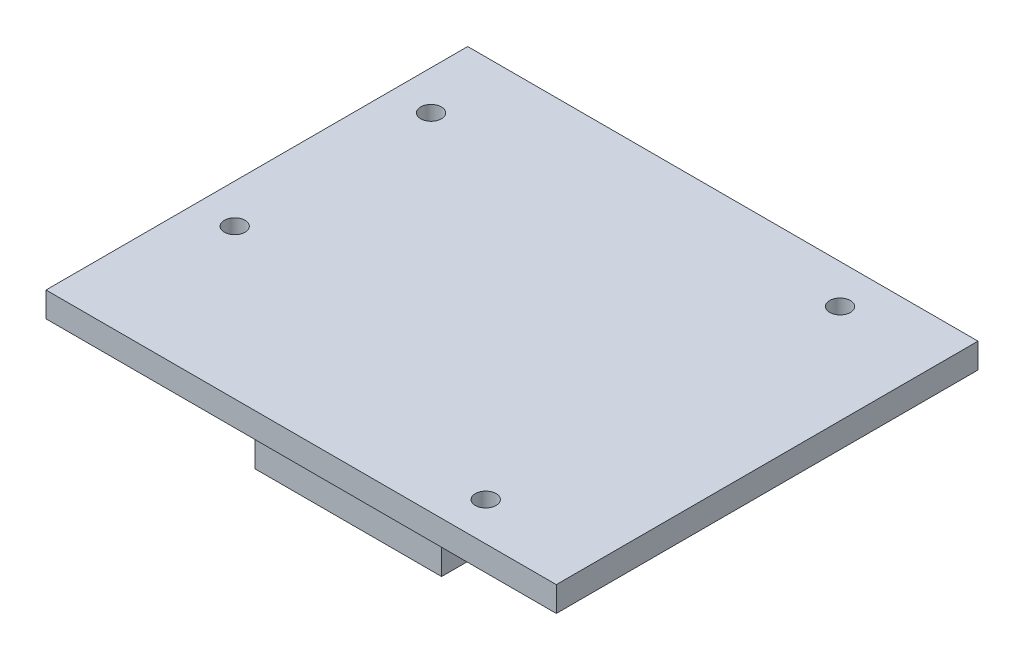
ISO-10303-21;
HEADER;
FILE_DESCRIPTION(('STEP AP214'),'2;1');
FILE_NAME('part.step','',(''),(''),'','','');
FILE_SCHEMA(('AUTOMOTIVE_DESIGN { 1 0 10303 214 1 1 1 1 }'));
ENDSEC;
DATA;
#1=APPLICATION_CONTEXT('core data for automotive mechanical design processes');
#2=APPLICATION_PROTOCOL_DEFINITION('international standard','automotive_design',2000,#1);
#3=PRODUCT_CONTEXT('',#1,'mechanical');
#4=PRODUCT('Part','Part','',(#3));
#5=PRODUCT_RELATED_PRODUCT_CATEGORY('part','',(#4));
#6=PRODUCT_DEFINITION_FORMATION('','',#4);
#7=PRODUCT_DEFINITION_CONTEXT('part definition',#1,'design');
#8=PRODUCT_DEFINITION('design','',#6,#7);
#9=PRODUCT_DEFINITION_SHAPE('','',#8);
#10=(LENGTH_UNIT() NAMED_UNIT(*) SI_UNIT(.MILLI.,.METRE.));
#11=(NAMED_UNIT(*) PLANE_ANGLE_UNIT() SI_UNIT($,.RADIAN.));
#12=(NAMED_UNIT(*) SI_UNIT($,.STERADIAN.) SOLID_ANGLE_UNIT());
#13=UNCERTAINTY_MEASURE_WITH_UNIT(LENGTH_MEASURE(1.E-05),#10,'distance_accuracy_value','');
#14=(GEOMETRIC_REPRESENTATION_CONTEXT(3) GLOBAL_UNCERTAINTY_ASSIGNED_CONTEXT((#13)) GLOBAL_UNIT_ASSIGNED_CONTEXT((#10,
#11,#12)) REPRESENTATION_CONTEXT('',''));
#15=CARTESIAN_POINT('',(0.,0.,0.));
#16=DIRECTION('',(0.,0.,1.));
#17=DIRECTION('',(1.,0.,0.));
#18=AXIS2_PLACEMENT_3D('',#15,#16,#17);
#19=CARTESIAN_POINT('',(0.,-3.5,0.));
#20=DIRECTION('',(0.,1.,0.));
#21=DIRECTION('',(0.,0.,1.));
#22=AXIS2_PLACEMENT_3D('',#19,#20,#21);
#23=PLANE('',#22);
#24=DIRECTION('',(0.,0.,1.));
#25=VECTOR('',#24,1.);
#26=CARTESIAN_POINT('',(-35.7,-3.5,29.5));
#27=LINE('',#26,#25);
#28=CARTESIAN_POINT('',(-35.7,-3.5,-29.5));
#29=VERTEX_POINT('',#28);
#30=CARTESIAN_POINT('',(-35.7,-3.5,29.5));
#31=VERTEX_POINT('',#30);
#32=EDGE_CURVE('E207',#29,#31,#27,.T.);
#33=ORIENTED_EDGE('',*,*,#32,.F.);
#34=DIRECTION('',(-1.,0.,0.));
#35=VECTOR('',#34,1.);
#36=CARTESIAN_POINT('',(35.7,-3.5,-29.5));
#37=LINE('',#36,#35);
#38=CARTESIAN_POINT('',(35.7,-3.5,-29.5));
#39=VERTEX_POINT('',#38);
#40=EDGE_CURVE('E217',#39,#29,#37,.T.);
#41=ORIENTED_EDGE('',*,*,#40,.F.);
#42=DIRECTION('',(0.,0.,-1.));
#43=VECTOR('',#42,1.);
#44=CARTESIAN_POINT('',(35.7,-3.5,29.5));
#45=LINE('',#44,#43);
#46=CARTESIAN_POINT('',(35.7,-3.5,29.5));
#47=VERTEX_POINT('',#46);
#48=EDGE_CURVE('E214',#47,#39,#45,.T.);
#49=ORIENTED_EDGE('',*,*,#48,.F.);
#50=DIRECTION('',(1.,0.,0.));
#51=VECTOR('',#50,1.);
#52=CARTESIAN_POINT('',(35.7,-3.5,29.5));
#53=LINE('',#52,#51);
#54=EDGE_CURVE('E210',#31,#47,#53,.T.);
#55=ORIENTED_EDGE('',*,*,#54,.F.);
#56=EDGE_LOOP('',(#33,#41,#49,#55));
#57=FACE_BOUND('',#56,.T.);
#58=CARTESIAN_POINT('',(20.453418066521,-3.5,24.1305439149757));
#59=DIRECTION('',(0.,1.,0.));
#60=DIRECTION('',(0.,0.,1.));
#61=AXIS2_PLACEMENT_3D('',#58,#59,#60);
#62=CIRCLE('',#61,1.45);
#63=CARTESIAN_POINT('',(20.453418066521,-3.5,25.5805439149757));
#64=VERTEX_POINT('',#63);
#65=EDGE_CURVE('E203',#64,#64,#62,.T.);
#66=ORIENTED_EDGE('',*,*,#65,.T.);
#67=EDGE_LOOP('',(#66));
#68=FACE_BOUND('',#67,.T.);
#69=CARTESIAN_POINT('',(-30.2235775893681,-3.5,-18.9));
#70=DIRECTION('',(0.,1.,0.));
#71=DIRECTION('',(0.,0.,1.));
#72=AXIS2_PLACEMENT_3D('',#69,#70,#71);
#73=CIRCLE('',#72,1.45);
#74=CARTESIAN_POINT('',(-30.2235775893681,-3.5,-17.45));
#75=VERTEX_POINT('',#74);
#76=EDGE_CURVE('E192',#75,#75,#73,.T.);
#77=ORIENTED_EDGE('',*,*,#76,.T.);
#78=EDGE_LOOP('',(#77));
#79=FACE_BOUND('',#78,.T.);
#80=CARTESIAN_POINT('',(-30.2235775893681,-3.5,8.57796743821394));
#81=DIRECTION('',(0.,1.,0.));
#82=DIRECTION('',(0.,0.,1.));
#83=AXIS2_PLACEMENT_3D('',#80,#81,#82);
#84=CIRCLE('',#83,1.45);
#85=CARTESIAN_POINT('',(-30.2235775893681,-3.5,10.0279674382139));
#86=VERTEX_POINT('',#85);
#87=EDGE_CURVE('E196',#86,#86,#84,.T.);
#88=ORIENTED_EDGE('',*,*,#87,.T.);
#89=EDGE_LOOP('',(#88));
#90=FACE_BOUND('',#89,.T.);
#91=CARTESIAN_POINT('',(21.85,-3.5,-24.05));
#92=DIRECTION('',(0.,1.,0.));
#93=DIRECTION('',(0.,0.,1.));
#94=AXIS2_PLACEMENT_3D('',#91,#92,#93);
#95=CIRCLE('',#94,1.45);
#96=CARTESIAN_POINT('',(21.85,-3.5,-22.6));
#97=VERTEX_POINT('',#96);
#98=EDGE_CURVE('E199',#97,#97,#95,.T.);
#99=ORIENTED_EDGE('',*,*,#98,.T.);
#100=EDGE_LOOP('',(#99));
#101=FACE_BOUND('',#100,.T.);
#102=DIRECTION('',(0.,0.,-1.));
#103=VECTOR('',#102,1.);
#104=CARTESIAN_POINT('',(-13.055,-3.5,-22.9));
#105=LINE('',#104,#103);
#106=CARTESIAN_POINT('',(-13.055,-3.5,22.9));
#107=VERTEX_POINT('',#106);
#108=CARTESIAN_POINT('',(-13.055,-3.5,-22.9));
#109=VERTEX_POINT('',#108);
#110=EDGE_CURVE('E158',#107,#109,#105,.T.);
#111=ORIENTED_EDGE('',*,*,#110,.F.);
#112=DIRECTION('',(-1.,0.,0.));
#113=VECTOR('',#112,1.);
#114=CARTESIAN_POINT('',(13.055,-3.5,22.9));
#115=LINE('',#114,#113);
#116=CARTESIAN_POINT('',(13.055,-3.5,22.9));
#117=VERTEX_POINT('',#116);
#118=EDGE_CURVE('E166',#117,#107,#115,.T.);
#119=ORIENTED_EDGE('',*,*,#118,.F.);
#120=DIRECTION('',(0.,0.,1.));
#121=VECTOR('',#120,1.);
#122=CARTESIAN_POINT('',(13.055,-3.5,-22.9));
#123=LINE('',#122,#121);
#124=CARTESIAN_POINT('',(13.055,-3.5,-22.9));
#125=VERTEX_POINT('',#124);
#126=EDGE_CURVE('E176',#125,#117,#123,.T.);
#127=ORIENTED_EDGE('',*,*,#126,.F.);
#128=DIRECTION('',(1.,0.,0.));
#129=VECTOR('',#128,1.);
#130=CARTESIAN_POINT('',(13.055,-3.5,-22.9));
#131=LINE('',#130,#129);
#132=EDGE_CURVE('E58',#109,#125,#131,.T.);
#133=ORIENTED_EDGE('',*,*,#132,.F.);
#134=EDGE_LOOP('',(#111,#119,#127,#133));
#135=FACE_BOUND('',#134,.T.);
#136=ADVANCED_FACE('F33',(#57,#68,#79,#90,#101,#135),#23,.F.);
#137=CARTESIAN_POINT('',(-35.7,-3.5,29.5));
#138=DIRECTION('',(-1.,0.,0.));
#139=DIRECTION('',(0.,0.,1.));
#140=AXIS2_PLACEMENT_3D('',#137,#138,#139);
#141=PLANE('',#140);
#142=DIRECTION('',(0.,0.,1.));
#143=VECTOR('',#142,1.);
#144=CARTESIAN_POINT('',(-35.7,0.,29.5));
#145=LINE('',#144,#143);
#146=CARTESIAN_POINT('',(-35.7,0.,-29.5));
#147=VERTEX_POINT('',#146);
#148=CARTESIAN_POINT('',(-35.7,0.,29.5));
#149=VERTEX_POINT('',#148);
#150=EDGE_CURVE('E206',#147,#149,#145,.T.);
#151=ORIENTED_EDGE('',*,*,#150,.F.);
#152=DIRECTION('',(0.,1.,0.));
#153=VECTOR('',#152,1.);
#154=CARTESIAN_POINT('',(-35.7,-3.5,-29.5));
#155=LINE('',#154,#153);
#156=EDGE_CURVE('E11',#29,#147,#155,.T.);
#157=ORIENTED_EDGE('',*,*,#156,.F.);
#158=ORIENTED_EDGE('',*,*,#32,.T.);
#159=DIRECTION('',(0.,1.,0.));
#160=VECTOR('',#159,1.);
#161=CARTESIAN_POINT('',(-35.7,-3.5,29.5));
#162=LINE('',#161,#160);
#163=EDGE_CURVE('E220',#31,#149,#162,.T.);
#164=ORIENTED_EDGE('',*,*,#163,.T.);
#165=EDGE_LOOP('',(#151,#157,#158,#164));
#166=FACE_BOUND('',#165,.T.);
#167=ADVANCED_FACE('F35',(#166),#141,.T.);
#168=CARTESIAN_POINT('',(35.7,-3.5,-29.5));
#169=DIRECTION('',(0.,0.,-1.));
#170=DIRECTION('',(-1.,0.,0.));
#171=AXIS2_PLACEMENT_3D('',#168,#169,#170);
#172=PLANE('',#171);
#173=DIRECTION('',(-1.,0.,0.));
#174=VECTOR('',#173,1.);
#175=CARTESIAN_POINT('',(35.7,0.,-29.5));
#176=LINE('',#175,#174);
#177=CARTESIAN_POINT('',(35.7,0.,-29.5));
#178=VERTEX_POINT('',#177);
#179=EDGE_CURVE('E211',#178,#147,#176,.T.);
#180=ORIENTED_EDGE('',*,*,#179,.F.);
#181=DIRECTION('',(0.,1.,0.));
#182=VECTOR('',#181,1.);
#183=CARTESIAN_POINT('',(35.7,-3.5,-29.5));
#184=LINE('',#183,#182);
#185=EDGE_CURVE('E42',#39,#178,#184,.T.);
#186=ORIENTED_EDGE('',*,*,#185,.F.);
#187=ORIENTED_EDGE('',*,*,#40,.T.);
#188=ORIENTED_EDGE('',*,*,#156,.T.);
#189=EDGE_LOOP('',(#180,#186,#187,#188));
#190=FACE_BOUND('',#189,.T.);
#191=ADVANCED_FACE('F267',(#190),#172,.T.);
#192=CARTESIAN_POINT('',(35.7,-3.5,29.5));
#193=DIRECTION('',(1.,0.,0.));
#194=DIRECTION('',(0.,0.,-1.));
#195=AXIS2_PLACEMENT_3D('',#192,#193,#194);
#196=PLANE('',#195);
#197=DIRECTION('',(0.,0.,-1.));
#198=VECTOR('',#197,1.);
#199=CARTESIAN_POINT('',(35.7,0.,29.5));
#200=LINE('',#199,#198);
#201=CARTESIAN_POINT('',(35.7,0.,29.5));
#202=VERTEX_POINT('',#201);
#203=EDGE_CURVE('E226',#202,#178,#200,.T.);
#204=ORIENTED_EDGE('',*,*,#203,.F.);
#205=DIRECTION('',(0.,1.,0.));
#206=VECTOR('',#205,1.);
#207=CARTESIAN_POINT('',(35.7,-3.5,29.5));
#208=LINE('',#207,#206);
#209=EDGE_CURVE('E232',#47,#202,#208,.T.);
#210=ORIENTED_EDGE('',*,*,#209,.F.);
#211=ORIENTED_EDGE('',*,*,#48,.T.);
#212=ORIENTED_EDGE('',*,*,#185,.T.);
#213=EDGE_LOOP('',(#204,#210,#211,#212));
#214=FACE_BOUND('',#213,.T.);
#215=ADVANCED_FACE('F265',(#214),#196,.T.);
#216=CARTESIAN_POINT('',(35.7,-3.5,29.5));
#217=DIRECTION('',(0.,0.,1.));
#218=DIRECTION('',(1.,0.,0.));
#219=AXIS2_PLACEMENT_3D('',#216,#217,#218);
#220=PLANE('',#219);
#221=DIRECTION('',(1.,0.,0.));
#222=VECTOR('',#221,1.);
#223=CARTESIAN_POINT('',(35.7,0.,29.5));
#224=LINE('',#223,#222);
#225=EDGE_CURVE('E223',#149,#202,#224,.T.);
#226=ORIENTED_EDGE('',*,*,#225,.F.);
#227=ORIENTED_EDGE('',*,*,#163,.F.);
#228=ORIENTED_EDGE('',*,*,#54,.T.);
#229=ORIENTED_EDGE('',*,*,#209,.T.);
#230=EDGE_LOOP('',(#226,#227,#228,#229));
#231=FACE_BOUND('',#230,.T.);
#232=ADVANCED_FACE('F248',(#231),#220,.T.);
#233=CARTESIAN_POINT('',(0.,0.,0.));
#234=DIRECTION('',(0.,1.,0.));
#235=DIRECTION('',(0.,0.,1.));
#236=AXIS2_PLACEMENT_3D('',#233,#234,#235);
#237=PLANE('',#236);
#238=CARTESIAN_POINT('',(21.85,0.,-24.05));
#239=DIRECTION('',(0.,1.,0.));
#240=DIRECTION('',(0.,0.,1.));
#241=AXIS2_PLACEMENT_3D('',#238,#239,#240);
#242=CIRCLE('',#241,1.45);
#243=CARTESIAN_POINT('',(21.85,0.,-22.6));
#244=VERTEX_POINT('',#243);
#245=EDGE_CURVE('E37',#244,#244,#242,.T.);
#246=ORIENTED_EDGE('',*,*,#245,.F.);
#247=EDGE_LOOP('',(#246));
#248=FACE_BOUND('',#247,.T.);
#249=CARTESIAN_POINT('',(-30.2235775893681,0.,8.57796743821394));
#250=DIRECTION('',(0.,1.,0.));
#251=DIRECTION('',(0.,0.,1.));
#252=AXIS2_PLACEMENT_3D('',#249,#250,#251);
#253=CIRCLE('',#252,1.45);
#254=CARTESIAN_POINT('',(-30.2235775893681,0.,10.0279674382139));
#255=VERTEX_POINT('',#254);
#256=EDGE_CURVE('E195',#255,#255,#253,.T.);
#257=ORIENTED_EDGE('',*,*,#256,.F.);
#258=EDGE_LOOP('',(#257));
#259=FACE_BOUND('',#258,.T.);
#260=CARTESIAN_POINT('',(-30.2235775893681,0.,-18.9));
#261=DIRECTION('',(0.,1.,0.));
#262=DIRECTION('',(0.,0.,1.));
#263=AXIS2_PLACEMENT_3D('',#260,#261,#262);
#264=CIRCLE('',#263,1.45);
#265=CARTESIAN_POINT('',(-30.2235775893681,0.,-17.45));
#266=VERTEX_POINT('',#265);
#267=EDGE_CURVE('E191',#266,#266,#264,.T.);
#268=ORIENTED_EDGE('',*,*,#267,.F.);
#269=EDGE_LOOP('',(#268));
#270=FACE_BOUND('',#269,.T.);
#271=CARTESIAN_POINT('',(20.453418066521,0.,24.1305439149757));
#272=DIRECTION('',(0.,1.,0.));
#273=DIRECTION('',(0.,0.,1.));
#274=AXIS2_PLACEMENT_3D('',#271,#272,#273);
#275=CIRCLE('',#274,1.45);
#276=CARTESIAN_POINT('',(20.453418066521,0.,25.5805439149757));
#277=VERTEX_POINT('',#276);
#278=EDGE_CURVE('E202',#277,#277,#275,.T.);
#279=ORIENTED_EDGE('',*,*,#278,.F.);
#280=EDGE_LOOP('',(#279));
#281=FACE_BOUND('',#280,.T.);
#282=ORIENTED_EDGE('',*,*,#150,.T.);
#283=ORIENTED_EDGE('',*,*,#225,.T.);
#284=ORIENTED_EDGE('',*,*,#203,.T.);
#285=ORIENTED_EDGE('',*,*,#179,.T.);
#286=EDGE_LOOP('',(#282,#283,#284,#285));
#287=FACE_BOUND('',#286,.T.);
#288=ADVANCED_FACE('F244',(#248,#259,#270,#281,#287),#237,.T.);
#289=CARTESIAN_POINT('',(20.453418066521,-15.,24.1305439149757));
#290=DIRECTION('',(0.,1.,0.));
#291=DIRECTION('',(0.,0.,1.));
#292=AXIS2_PLACEMENT_3D('',#289,#290,#291);
#293=CYLINDRICAL_SURFACE('',#292,1.45);
#294=ORIENTED_EDGE('',*,*,#278,.T.);
#295=EDGE_LOOP('',(#294));
#296=FACE_BOUND('',#295,.T.);
#297=ORIENTED_EDGE('',*,*,#65,.F.);
#298=EDGE_LOOP('',(#297));
#299=FACE_BOUND('',#298,.T.);
#300=ADVANCED_FACE('F247',(#296,#299),#293,.F.);
#301=CARTESIAN_POINT('',(-30.2235775893681,-15.,-18.9));
#302=DIRECTION('',(0.,1.,0.));
#303=DIRECTION('',(0.,0.,1.));
#304=AXIS2_PLACEMENT_3D('',#301,#302,#303);
#305=CYLINDRICAL_SURFACE('',#304,1.45);
#306=ORIENTED_EDGE('',*,*,#267,.T.);
#307=EDGE_LOOP('',(#306));
#308=FACE_BOUND('',#307,.T.);
#309=ORIENTED_EDGE('',*,*,#76,.F.);
#310=EDGE_LOOP('',(#309));
#311=FACE_BOUND('',#310,.T.);
#312=ADVANCED_FACE('F310',(#308,#311),#305,.F.);
#313=CARTESIAN_POINT('',(-30.2235775893681,-15.,8.57796743821394));
#314=DIRECTION('',(0.,1.,0.));
#315=DIRECTION('',(0.,0.,1.));
#316=AXIS2_PLACEMENT_3D('',#313,#314,#315);
#317=CYLINDRICAL_SURFACE('',#316,1.45);
#318=ORIENTED_EDGE('',*,*,#256,.T.);
#319=EDGE_LOOP('',(#318));
#320=FACE_BOUND('',#319,.T.);
#321=ORIENTED_EDGE('',*,*,#87,.F.);
#322=EDGE_LOOP('',(#321));
#323=FACE_BOUND('',#322,.T.);
#324=ADVANCED_FACE('F241',(#320,#323),#317,.F.);
#325=CARTESIAN_POINT('',(21.85,-15.,-24.05));
#326=DIRECTION('',(0.,1.,0.));
#327=DIRECTION('',(0.,0.,1.));
#328=AXIS2_PLACEMENT_3D('',#325,#326,#327);
#329=CYLINDRICAL_SURFACE('',#328,1.45);
#330=ORIENTED_EDGE('',*,*,#245,.T.);
#331=EDGE_LOOP('',(#330));
#332=FACE_BOUND('',#331,.T.);
#333=ORIENTED_EDGE('',*,*,#98,.F.);
#334=EDGE_LOOP('',(#333));
#335=FACE_BOUND('',#334,.T.);
#336=ADVANCED_FACE('F304',(#332,#335),#329,.F.);
#337=CARTESIAN_POINT('',(-13.055,-13.65,-22.9));
#338=DIRECTION('',(1.,0.,0.));
#339=DIRECTION('',(0.,0.,-1.));
#340=AXIS2_PLACEMENT_3D('',#337,#338,#339);
#341=PLANE('',#340);
#342=ORIENTED_EDGE('',*,*,#110,.T.);
#343=DIRECTION('',(0.,1.,0.));
#344=VECTOR('',#343,1.);
#345=CARTESIAN_POINT('',(-13.055,-13.65,-22.9));
#346=LINE('',#345,#344);
#347=CARTESIAN_POINT('',(-13.055,-13.65,-22.9));
#348=VERTEX_POINT('',#347);
#349=EDGE_CURVE('E189',#348,#109,#346,.T.);
#350=ORIENTED_EDGE('',*,*,#349,.F.);
#351=DIRECTION('',(0.,0.,-1.));
#352=VECTOR('',#351,1.);
#353=CARTESIAN_POINT('',(-13.055,-13.65,-22.9));
#354=LINE('',#353,#352);
#355=CARTESIAN_POINT('',(-13.055,-13.65,22.9));
#356=VERTEX_POINT('',#355);
#357=EDGE_CURVE('E162',#356,#348,#354,.T.);
#358=ORIENTED_EDGE('',*,*,#357,.F.);
#359=DIRECTION('',(0.,1.,0.));
#360=VECTOR('',#359,1.);
#361=CARTESIAN_POINT('',(-13.055,-13.65,22.9));
#362=LINE('',#361,#360);
#363=EDGE_CURVE('E172',#356,#107,#362,.T.);
#364=ORIENTED_EDGE('',*,*,#363,.T.);
#365=EDGE_LOOP('',(#342,#350,#358,#364));
#366=FACE_BOUND('',#365,.T.);
#367=ADVANCED_FACE('F288',(#366),#341,.F.);
#368=CARTESIAN_POINT('',(13.055,-13.65,-22.9));
#369=DIRECTION('',(0.,0.,1.));
#370=DIRECTION('',(1.,0.,0.));
#371=AXIS2_PLACEMENT_3D('',#368,#369,#370);
#372=PLANE('',#371);
#373=ORIENTED_EDGE('',*,*,#132,.T.);
#374=DIRECTION('',(0.,1.,0.));
#375=VECTOR('',#374,1.);
#376=CARTESIAN_POINT('',(13.055,-13.65,-22.9));
#377=LINE('',#376,#375);
#378=CARTESIAN_POINT('',(13.055,-13.65,-22.9));
#379=VERTEX_POINT('',#378);
#380=EDGE_CURVE('E186',#379,#125,#377,.T.);
#381=ORIENTED_EDGE('',*,*,#380,.F.);
#382=DIRECTION('',(1.,0.,0.));
#383=VECTOR('',#382,1.);
#384=CARTESIAN_POINT('',(13.055,-13.65,-22.9));
#385=LINE('',#384,#383);
#386=EDGE_CURVE('E165',#348,#379,#385,.T.);
#387=ORIENTED_EDGE('',*,*,#386,.F.);
#388=ORIENTED_EDGE('',*,*,#349,.T.);
#389=EDGE_LOOP('',(#373,#381,#387,#388));
#390=FACE_BOUND('',#389,.T.);
#391=ADVANCED_FACE('F296',(#390),#372,.F.);
#392=CARTESIAN_POINT('',(13.055,-13.65,-22.9));
#393=DIRECTION('',(-1.,0.,0.));
#394=DIRECTION('',(0.,0.,1.));
#395=AXIS2_PLACEMENT_3D('',#392,#393,#394);
#396=PLANE('',#395);
#397=ORIENTED_EDGE('',*,*,#126,.T.);
#398=DIRECTION('',(0.,1.,0.));
#399=VECTOR('',#398,1.);
#400=CARTESIAN_POINT('',(13.055,-13.65,22.9));
#401=LINE('',#400,#399);
#402=CARTESIAN_POINT('',(13.055,-13.65,22.9));
#403=VERTEX_POINT('',#402);
#404=EDGE_CURVE('E183',#403,#117,#401,.T.);
#405=ORIENTED_EDGE('',*,*,#404,.F.);
#406=DIRECTION('',(0.,0.,1.));
#407=VECTOR('',#406,1.);
#408=CARTESIAN_POINT('',(13.055,-13.65,-22.9));
#409=LINE('',#408,#407);
#410=EDGE_CURVE('E168',#379,#403,#409,.T.);
#411=ORIENTED_EDGE('',*,*,#410,.F.);
#412=ORIENTED_EDGE('',*,*,#380,.T.);
#413=EDGE_LOOP('',(#397,#405,#411,#412));
#414=FACE_BOUND('',#413,.T.);
#415=ADVANCED_FACE('F294',(#414),#396,.F.);
#416=CARTESIAN_POINT('',(13.055,-13.65,22.9));
#417=DIRECTION('',(0.,0.,-1.));
#418=DIRECTION('',(-1.,0.,0.));
#419=AXIS2_PLACEMENT_3D('',#416,#417,#418);
#420=PLANE('',#419);
#421=ORIENTED_EDGE('',*,*,#118,.T.);
#422=ORIENTED_EDGE('',*,*,#363,.F.);
#423=DIRECTION('',(-1.,0.,0.));
#424=VECTOR('',#423,1.);
#425=CARTESIAN_POINT('',(13.055,-13.65,22.9));
#426=LINE('',#425,#424);
#427=EDGE_CURVE('E170',#403,#356,#426,.T.);
#428=ORIENTED_EDGE('',*,*,#427,.F.);
#429=ORIENTED_EDGE('',*,*,#404,.T.);
#430=EDGE_LOOP('',(#421,#422,#428,#429));
#431=FACE_BOUND('',#430,.T.);
#432=ADVANCED_FACE('F284',(#431),#420,.F.);
#433=CARTESIAN_POINT('',(0.,-13.65,0.));
#434=DIRECTION('',(0.,-1.,0.));
#435=DIRECTION('',(0.,0.,-1.));
#436=AXIS2_PLACEMENT_3D('',#433,#434,#435);
#437=PLANE('',#436);
#438=DIRECTION('',(0.,0.,-1.));
#439=VECTOR('',#438,1.);
#440=CARTESIAN_POINT('',(-10.,-13.65,-19.775));
#441=LINE('',#440,#439);
#442=CARTESIAN_POINT('',(-10.,-13.65,19.775));
#443=VERTEX_POINT('',#442);
#444=CARTESIAN_POINT('',(-10.,-13.65,-19.775));
#445=VERTEX_POINT('',#444);
#446=EDGE_CURVE('E50',#443,#445,#441,.T.);
#447=ORIENTED_EDGE('',*,*,#446,.F.);
#448=DIRECTION('',(-1.,0.,0.));
#449=VECTOR('',#448,1.);
#450=CARTESIAN_POINT('',(10.,-13.65,19.775));
#451=LINE('',#450,#449);
#452=CARTESIAN_POINT('',(10.,-13.65,19.775));
#453=VERTEX_POINT('',#452);
#454=EDGE_CURVE('E143',#453,#443,#451,.T.);
#455=ORIENTED_EDGE('',*,*,#454,.F.);
#456=DIRECTION('',(0.,0.,1.));
#457=VECTOR('',#456,1.);
#458=CARTESIAN_POINT('',(10.,-13.65,-19.775));
#459=LINE('',#458,#457);
#460=CARTESIAN_POINT('',(10.,-13.65,-19.775));
#461=VERTEX_POINT('',#460);
#462=EDGE_CURVE('E146',#461,#453,#459,.T.);
#463=ORIENTED_EDGE('',*,*,#462,.F.);
#464=DIRECTION('',(1.,0.,0.));
#465=VECTOR('',#464,1.);
#466=CARTESIAN_POINT('',(10.,-13.65,-19.775));
#467=LINE('',#466,#465);
#468=EDGE_CURVE('E152',#445,#461,#467,.T.);
#469=ORIENTED_EDGE('',*,*,#468,.F.);
#470=EDGE_LOOP('',(#447,#455,#463,#469));
#471=FACE_BOUND('',#470,.T.);
#472=ORIENTED_EDGE('',*,*,#357,.T.);
#473=ORIENTED_EDGE('',*,*,#386,.T.);
#474=ORIENTED_EDGE('',*,*,#410,.T.);
#475=ORIENTED_EDGE('',*,*,#427,.T.);
#476=EDGE_LOOP('',(#472,#473,#474,#475));
#477=FACE_BOUND('',#476,.T.);
#478=ADVANCED_FACE('F290',(#471,#477),#437,.T.);
#479=CARTESIAN_POINT('',(-10.,-3.5,-19.775));
#480=DIRECTION('',(-1.,0.,0.));
#481=DIRECTION('',(0.,0.,1.));
#482=AXIS2_PLACEMENT_3D('',#479,#480,#481);
#483=PLANE('',#482);
#484=ORIENTED_EDGE('',*,*,#446,.T.);
#485=DIRECTION('',(0.,-1.,0.));
#486=VECTOR('',#485,1.);
#487=CARTESIAN_POINT('',(-10.,-3.5,-19.775));
#488=LINE('',#487,#486);
#489=CARTESIAN_POINT('',(-10.,-3.5,-19.775));
#490=VERTEX_POINT('',#489);
#491=EDGE_CURVE('E121',#490,#445,#488,.T.);
#492=ORIENTED_EDGE('',*,*,#491,.F.);
#493=DIRECTION('',(0.,0.,-1.));
#494=VECTOR('',#493,1.);
#495=CARTESIAN_POINT('',(-10.,-3.5,-19.775));
#496=LINE('',#495,#494);
#497=CARTESIAN_POINT('',(-10.,-3.5,19.775));
#498=VERTEX_POINT('',#497);
#499=EDGE_CURVE('E125',#498,#490,#496,.T.);
#500=ORIENTED_EDGE('',*,*,#499,.F.);
#501=DIRECTION('',(0.,-1.,0.));
#502=VECTOR('',#501,1.);
#503=CARTESIAN_POINT('',(-10.,-3.5,19.775));
#504=LINE('',#503,#502);
#505=EDGE_CURVE('E156',#498,#443,#504,.T.);
#506=ORIENTED_EDGE('',*,*,#505,.T.);
#507=EDGE_LOOP('',(#484,#492,#500,#506));
#508=FACE_BOUND('',#507,.T.);
#509=ADVANCED_FACE('F123',(#508),#483,.F.);
#510=CARTESIAN_POINT('',(10.,-3.5,19.775));
#511=DIRECTION('',(0.,0.,1.));
#512=DIRECTION('',(1.,0.,0.));
#513=AXIS2_PLACEMENT_3D('',#510,#511,#512);
#514=PLANE('',#513);
#515=ORIENTED_EDGE('',*,*,#454,.T.);
#516=ORIENTED_EDGE('',*,*,#505,.F.);
#517=DIRECTION('',(-1.,0.,0.));
#518=VECTOR('',#517,1.);
#519=CARTESIAN_POINT('',(10.,-3.5,19.775));
#520=LINE('',#519,#518);
#521=CARTESIAN_POINT('',(10.,-3.5,19.775));
#522=VERTEX_POINT('',#521);
#523=EDGE_CURVE('E131',#522,#498,#520,.T.);
#524=ORIENTED_EDGE('',*,*,#523,.F.);
#525=DIRECTION('',(0.,-1.,0.));
#526=VECTOR('',#525,1.);
#527=CARTESIAN_POINT('',(10.,-3.5,19.775));
#528=LINE('',#527,#526);
#529=EDGE_CURVE('E159',#522,#453,#528,.T.);
#530=ORIENTED_EDGE('',*,*,#529,.T.);
#531=EDGE_LOOP('',(#515,#516,#524,#530));
#532=FACE_BOUND('',#531,.T.);
#533=ADVANCED_FACE('F390',(#532),#514,.F.);
#534=CARTESIAN_POINT('',(10.,-3.5,-19.775));
#535=DIRECTION('',(1.,0.,0.));
#536=DIRECTION('',(0.,0.,-1.));
#537=AXIS2_PLACEMENT_3D('',#534,#535,#536);
#538=PLANE('',#537);
#539=ORIENTED_EDGE('',*,*,#462,.T.);
#540=ORIENTED_EDGE('',*,*,#529,.F.);
#541=DIRECTION('',(0.,0.,1.));
#542=VECTOR('',#541,1.);
#543=CARTESIAN_POINT('',(10.,-3.5,-19.775));
#544=LINE('',#543,#542);
#545=CARTESIAN_POINT('',(10.,-3.5,-19.775));
#546=VERTEX_POINT('',#545);
#547=EDGE_CURVE('E139',#546,#522,#544,.T.);
#548=ORIENTED_EDGE('',*,*,#547,.F.);
#549=DIRECTION('',(0.,-1.,0.));
#550=VECTOR('',#549,1.);
#551=CARTESIAN_POINT('',(10.,-3.5,-19.775));
#552=LINE('',#551,#550);
#553=EDGE_CURVE('E130',#546,#461,#552,.T.);
#554=ORIENTED_EDGE('',*,*,#553,.T.);
#555=EDGE_LOOP('',(#539,#540,#548,#554));
#556=FACE_BOUND('',#555,.T.);
#557=ADVANCED_FACE('F399',(#556),#538,.F.);
#558=CARTESIAN_POINT('',(10.,-3.5,-19.775));
#559=DIRECTION('',(0.,0.,-1.));
#560=DIRECTION('',(-1.,0.,0.));
#561=AXIS2_PLACEMENT_3D('',#558,#559,#560);
#562=PLANE('',#561);
#563=ORIENTED_EDGE('',*,*,#468,.T.);
#564=ORIENTED_EDGE('',*,*,#553,.F.);
#565=DIRECTION('',(1.,0.,0.));
#566=VECTOR('',#565,1.);
#567=CARTESIAN_POINT('',(10.,-3.5,-19.775));
#568=LINE('',#567,#566);
#569=EDGE_CURVE('E134',#490,#546,#568,.T.);
#570=ORIENTED_EDGE('',*,*,#569,.F.);
#571=ORIENTED_EDGE('',*,*,#491,.T.);
#572=EDGE_LOOP('',(#563,#564,#570,#571));
#573=FACE_BOUND('',#572,.T.);
#574=ADVANCED_FACE('F135',(#573),#562,.F.);
#575=CARTESIAN_POINT('',(0.,-3.5,0.));
#576=DIRECTION('',(0.,-1.,0.));
#577=DIRECTION('',(0.,0.,-1.));
#578=AXIS2_PLACEMENT_3D('',#575,#576,#577);
#579=PLANE('',#578);
#580=ORIENTED_EDGE('',*,*,#499,.T.);
#581=ORIENTED_EDGE('',*,*,#569,.T.);
#582=ORIENTED_EDGE('',*,*,#547,.T.);
#583=ORIENTED_EDGE('',*,*,#523,.T.);
#584=EDGE_LOOP('',(#580,#581,#582,#583));
#585=FACE_BOUND('',#584,.T.);
#586=ADVANCED_FACE('F141',(#585),#579,.T.);
#587=CLOSED_SHELL('',(#136,#167,#191,#215,#232,#288,#300,#312,#324,#336,#367,#391,#415,#432,
#478,#509,#533,#557,#574,#586));
#588=MANIFOLD_SOLID_BREP('B2',#587);
#589=ADVANCED_BREP_SHAPE_REPRESENTATION('',(#18,#588),#14);
#590=SHAPE_DEFINITION_REPRESENTATION(#9,#589);
ENDSEC;
END-ISO-10303-21;
